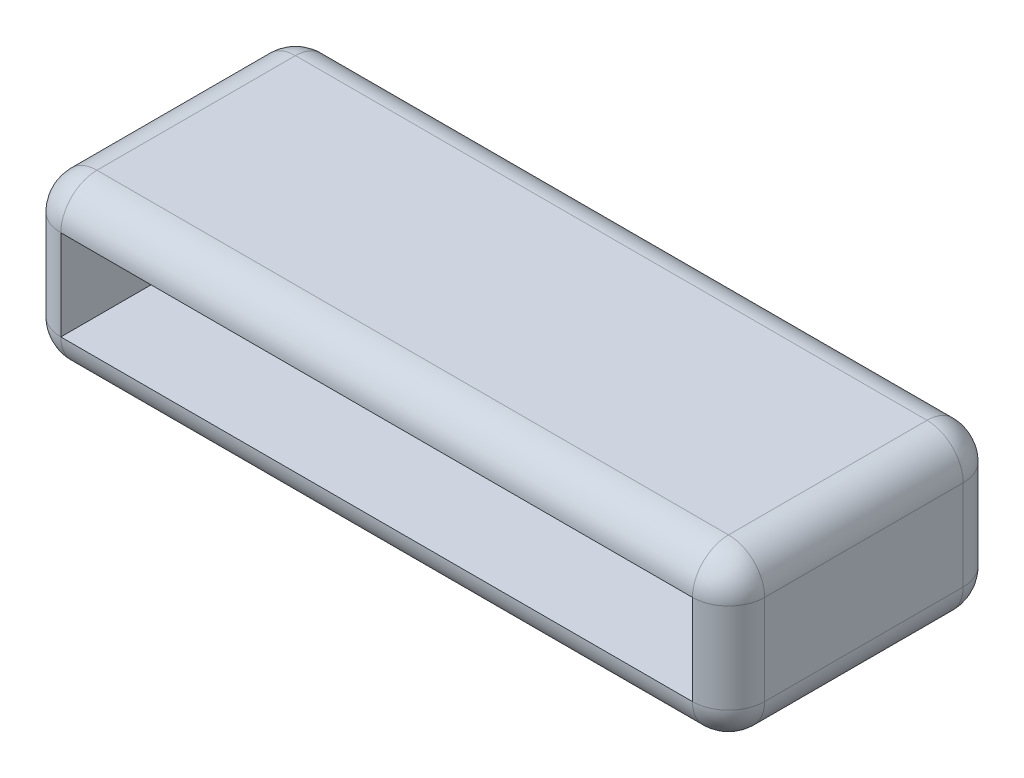
ISO-10303-21;
HEADER;
FILE_DESCRIPTION(('STEP AP214'),'2;1');
FILE_NAME('part.step','',(''),(''),'','','');
FILE_SCHEMA(('AUTOMOTIVE_DESIGN { 1 0 10303 214 1 1 1 1 }'));
ENDSEC;
DATA;
#1=APPLICATION_CONTEXT('core data for automotive mechanical design processes');
#2=APPLICATION_PROTOCOL_DEFINITION('international standard','automotive_design',2000,#1);
#3=PRODUCT_CONTEXT('',#1,'mechanical');
#4=PRODUCT('Part','Part','',(#3));
#5=PRODUCT_RELATED_PRODUCT_CATEGORY('part','',(#4));
#6=PRODUCT_DEFINITION_FORMATION('','',#4);
#7=PRODUCT_DEFINITION_CONTEXT('part definition',#1,'design');
#8=PRODUCT_DEFINITION('design','',#6,#7);
#9=PRODUCT_DEFINITION_SHAPE('','',#8);
#10=(LENGTH_UNIT() NAMED_UNIT(*) SI_UNIT(.MILLI.,.METRE.));
#11=(NAMED_UNIT(*) PLANE_ANGLE_UNIT() SI_UNIT($,.RADIAN.));
#12=(NAMED_UNIT(*) SI_UNIT($,.STERADIAN.) SOLID_ANGLE_UNIT());
#13=UNCERTAINTY_MEASURE_WITH_UNIT(LENGTH_MEASURE(1.E-05),#10,'distance_accuracy_value','');
#14=(GEOMETRIC_REPRESENTATION_CONTEXT(3) GLOBAL_UNCERTAINTY_ASSIGNED_CONTEXT((#13)) GLOBAL_UNIT_ASSIGNED_CONTEXT((#10,
#11,#12)) REPRESENTATION_CONTEXT('',''));
#15=CARTESIAN_POINT('',(0.,0.,0.));
#16=DIRECTION('',(0.,0.,1.));
#17=DIRECTION('',(1.,0.,0.));
#18=AXIS2_PLACEMENT_3D('',#15,#16,#17);
#19=CARTESIAN_POINT('',(19.5,-4.5,15.));
#20=DIRECTION('',(-1.,0.,0.));
#21=DIRECTION('',(0.,0.,1.));
#22=AXIS2_PLACEMENT_3D('',#19,#20,#21);
#23=PLANE('',#22);
#24=DIRECTION('',(0.,1.,0.));
#25=VECTOR('',#24,1.);
#26=CARTESIAN_POINT('',(19.5,-4.5,13.));
#27=LINE('',#26,#25);
#28=CARTESIAN_POINT('',(19.5,2.5,13.));
#29=VERTEX_POINT('',#28);
#30=CARTESIAN_POINT('',(19.5,-2.5,13.));
#31=VERTEX_POINT('',#30);
#32=EDGE_CURVE('E216',#29,#31,#27,.F.);
#33=ORIENTED_EDGE('',*,*,#32,.T.);
#34=DIRECTION('',(0.,0.,-1.));
#35=VECTOR('',#34,1.);
#36=CARTESIAN_POINT('',(19.5,-2.5,15.));
#37=LINE('',#36,#35);
#38=CARTESIAN_POINT('',(19.5,-2.5,2.));
#39=VERTEX_POINT('',#38);
#40=EDGE_CURVE('E218',#31,#39,#37,.T.);
#41=ORIENTED_EDGE('',*,*,#40,.T.);
#42=DIRECTION('',(0.,1.,0.));
#43=VECTOR('',#42,1.);
#44=CARTESIAN_POINT('',(19.5,4.5,2.));
#45=LINE('',#44,#43);
#46=CARTESIAN_POINT('',(19.5,2.5,2.));
#47=VERTEX_POINT('',#46);
#48=EDGE_CURVE('E214',#39,#47,#45,.T.);
#49=ORIENTED_EDGE('',*,*,#48,.T.);
#50=DIRECTION('',(0.,0.,-1.));
#51=VECTOR('',#50,1.);
#52=CARTESIAN_POINT('',(19.5,2.5,15.));
#53=LINE('',#52,#51);
#54=EDGE_CURVE('E212',#47,#29,#53,.F.);
#55=ORIENTED_EDGE('',*,*,#54,.T.);
#56=EDGE_LOOP('',(#33,#41,#49,#55));
#57=FACE_BOUND('',#56,.T.);
#58=ADVANCED_FACE('F47',(#57),#23,.F.);
#59=CARTESIAN_POINT('',(-19.5,4.5,15.));
#60=DIRECTION('',(0.,-1.,0.));
#61=DIRECTION('',(0.,0.,-1.));
#62=AXIS2_PLACEMENT_3D('',#59,#60,#61);
#63=PLANE('',#62);
#64=DIRECTION('',(-1.,0.,0.));
#65=VECTOR('',#64,1.);
#66=CARTESIAN_POINT('',(-19.5,4.5,13.));
#67=LINE('',#66,#65);
#68=CARTESIAN_POINT('',(-17.5,4.5,13.));
#69=VERTEX_POINT('',#68);
#70=CARTESIAN_POINT('',(17.5,4.5,13.));
#71=VERTEX_POINT('',#70);
#72=EDGE_CURVE('E56',#69,#71,#67,.F.);
#73=ORIENTED_EDGE('',*,*,#72,.T.);
#74=DIRECTION('',(0.,0.,-1.));
#75=VECTOR('',#74,1.);
#76=CARTESIAN_POINT('',(17.5,4.5,15.));
#77=LINE('',#76,#75);
#78=CARTESIAN_POINT('',(17.5,4.5,2.));
#79=VERTEX_POINT('',#78);
#80=EDGE_CURVE('E13',#71,#79,#77,.T.);
#81=ORIENTED_EDGE('',*,*,#80,.T.);
#82=DIRECTION('',(-1.,0.,0.));
#83=VECTOR('',#82,1.);
#84=CARTESIAN_POINT('',(-19.5,4.5,2.));
#85=LINE('',#84,#83);
#86=CARTESIAN_POINT('',(-17.5,4.5,2.));
#87=VERTEX_POINT('',#86);
#88=EDGE_CURVE('E221',#79,#87,#85,.T.);
#89=ORIENTED_EDGE('',*,*,#88,.T.);
#90=DIRECTION('',(0.,0.,-1.));
#91=VECTOR('',#90,1.);
#92=CARTESIAN_POINT('',(-17.5,4.5,15.));
#93=LINE('',#92,#91);
#94=EDGE_CURVE('E67',#87,#69,#93,.F.);
#95=ORIENTED_EDGE('',*,*,#94,.T.);
#96=EDGE_LOOP('',(#73,#81,#89,#95));
#97=FACE_BOUND('',#96,.T.);
#98=ADVANCED_FACE('F348',(#97),#63,.F.);
#99=CARTESIAN_POINT('',(-19.5,-4.5,15.));
#100=DIRECTION('',(1.,0.,0.));
#101=DIRECTION('',(0.,0.,-1.));
#102=AXIS2_PLACEMENT_3D('',#99,#100,#101);
#103=PLANE('',#102);
#104=DIRECTION('',(0.,-1.,0.));
#105=VECTOR('',#104,1.);
#106=CARTESIAN_POINT('',(-19.5,-4.5,2.));
#107=LINE('',#106,#105);
#108=CARTESIAN_POINT('',(-19.5,2.5,2.));
#109=VERTEX_POINT('',#108);
#110=CARTESIAN_POINT('',(-19.5,-2.5,2.));
#111=VERTEX_POINT('',#110);
#112=EDGE_CURVE('E187',#109,#111,#107,.T.);
#113=ORIENTED_EDGE('',*,*,#112,.T.);
#114=DIRECTION('',(0.,0.,-1.));
#115=VECTOR('',#114,1.);
#116=CARTESIAN_POINT('',(-19.5,-2.5,15.));
#117=LINE('',#116,#115);
#118=CARTESIAN_POINT('',(-19.5,-2.5,13.));
#119=VERTEX_POINT('',#118);
#120=EDGE_CURVE('E192',#111,#119,#117,.F.);
#121=ORIENTED_EDGE('',*,*,#120,.T.);
#122=DIRECTION('',(0.,-1.,0.));
#123=VECTOR('',#122,1.);
#124=CARTESIAN_POINT('',(-19.5,-4.5,13.));
#125=LINE('',#124,#123);
#126=CARTESIAN_POINT('',(-19.5,2.5,13.));
#127=VERTEX_POINT('',#126);
#128=EDGE_CURVE('E189',#119,#127,#125,.F.);
#129=ORIENTED_EDGE('',*,*,#128,.T.);
#130=DIRECTION('',(0.,0.,-1.));
#131=VECTOR('',#130,1.);
#132=CARTESIAN_POINT('',(-19.5,2.5,15.));
#133=LINE('',#132,#131);
#134=EDGE_CURVE('E185',#127,#109,#133,.T.);
#135=ORIENTED_EDGE('',*,*,#134,.T.);
#136=EDGE_LOOP('',(#113,#121,#129,#135));
#137=FACE_BOUND('',#136,.T.);
#138=ADVANCED_FACE('F361',(#137),#103,.F.);
#139=CARTESIAN_POINT('',(-19.5,-4.5,15.));
#140=DIRECTION('',(0.,1.,0.));
#141=DIRECTION('',(0.,0.,1.));
#142=AXIS2_PLACEMENT_3D('',#139,#140,#141);
#143=PLANE('',#142);
#144=DIRECTION('',(1.,0.,0.));
#145=VECTOR('',#144,1.);
#146=CARTESIAN_POINT('',(-19.5,-4.5,13.));
#147=LINE('',#146,#145);
#148=CARTESIAN_POINT('',(17.5,-4.5,13.));
#149=VERTEX_POINT('',#148);
#150=CARTESIAN_POINT('',(-17.5,-4.5,13.));
#151=VERTEX_POINT('',#150);
#152=EDGE_CURVE('E207',#149,#151,#147,.F.);
#153=ORIENTED_EDGE('',*,*,#152,.T.);
#154=DIRECTION('',(0.,0.,-1.));
#155=VECTOR('',#154,1.);
#156=CARTESIAN_POINT('',(-17.5000000000001,-4.5,15.));
#157=LINE('',#156,#155);
#158=CARTESIAN_POINT('',(-17.5,-4.5,2.));
#159=VERTEX_POINT('',#158);
#160=EDGE_CURVE('E209',#151,#159,#157,.T.);
#161=ORIENTED_EDGE('',*,*,#160,.T.);
#162=DIRECTION('',(1.,0.,0.));
#163=VECTOR('',#162,1.);
#164=CARTESIAN_POINT('',(19.5,-4.5,2.));
#165=LINE('',#164,#163);
#166=CARTESIAN_POINT('',(17.5,-4.5,2.));
#167=VERTEX_POINT('',#166);
#168=EDGE_CURVE('E205',#159,#167,#165,.T.);
#169=ORIENTED_EDGE('',*,*,#168,.T.);
#170=DIRECTION('',(0.,0.,-1.));
#171=VECTOR('',#170,1.);
#172=CARTESIAN_POINT('',(17.5,-4.5,15.));
#173=LINE('',#172,#171);
#174=EDGE_CURVE('E203',#167,#149,#173,.F.);
#175=ORIENTED_EDGE('',*,*,#174,.T.);
#176=EDGE_LOOP('',(#153,#161,#169,#175));
#177=FACE_BOUND('',#176,.T.);
#178=ADVANCED_FACE('F369',(#177),#143,.F.);
#179=CARTESIAN_POINT('',(0.,0.,0.));
#180=DIRECTION('',(0.,0.,-1.));
#181=DIRECTION('',(-1.,0.,0.));
#182=AXIS2_PLACEMENT_3D('',#179,#180,#181);
#183=PLANE('',#182);
#184=DIRECTION('',(1.,0.,0.));
#185=VECTOR('',#184,1.);
#186=CARTESIAN_POINT('',(-19.5,-2.5,0.));
#187=LINE('',#186,#185);
#188=CARTESIAN_POINT('',(17.5,-2.5,0.));
#189=VERTEX_POINT('',#188);
#190=CARTESIAN_POINT('',(-17.5,-2.5,0.));
#191=VERTEX_POINT('',#190);
#192=EDGE_CURVE('E198',#189,#191,#187,.F.);
#193=ORIENTED_EDGE('',*,*,#192,.T.);
#194=DIRECTION('',(0.,-1.,0.));
#195=VECTOR('',#194,1.);
#196=CARTESIAN_POINT('',(-17.5,4.5,0.));
#197=LINE('',#196,#195);
#198=CARTESIAN_POINT('',(-17.5,2.5,0.));
#199=VERTEX_POINT('',#198);
#200=EDGE_CURVE('E200',#191,#199,#197,.F.);
#201=ORIENTED_EDGE('',*,*,#200,.T.);
#202=DIRECTION('',(-1.,0.,0.));
#203=VECTOR('',#202,1.);
#204=CARTESIAN_POINT('',(19.5,2.5,0.));
#205=LINE('',#204,#203);
#206=CARTESIAN_POINT('',(17.5,2.5,0.));
#207=VERTEX_POINT('',#206);
#208=EDGE_CURVE('E194',#199,#207,#205,.F.);
#209=ORIENTED_EDGE('',*,*,#208,.T.);
#210=DIRECTION('',(0.,1.,0.));
#211=VECTOR('',#210,1.);
#212=CARTESIAN_POINT('',(17.5,-4.5,0.));
#213=LINE('',#212,#211);
#214=EDGE_CURVE('E196',#207,#189,#213,.F.);
#215=ORIENTED_EDGE('',*,*,#214,.T.);
#216=EDGE_LOOP('',(#193,#201,#209,#215));
#217=FACE_BOUND('',#216,.T.);
#218=ADVANCED_FACE('F579',(#217),#183,.T.);
#219=CARTESIAN_POINT('',(17.5,-4.5,15.));
#220=DIRECTION('',(-1.,0.,0.));
#221=DIRECTION('',(0.,0.,1.));
#222=AXIS2_PLACEMENT_3D('',#219,#220,#221);
#223=PLANE('',#222);
#224=DIRECTION('',(0.,1.,0.));
#225=VECTOR('',#224,1.);
#226=CARTESIAN_POINT('',(17.5,0.,2.));
#227=LINE('',#226,#225);
#228=CARTESIAN_POINT('',(17.5,-2.5,2.));
#229=VERTEX_POINT('',#228);
#230=CARTESIAN_POINT('',(17.5,2.5,2.));
#231=VERTEX_POINT('',#230);
#232=EDGE_CURVE('E153',#229,#231,#227,.T.);
#233=ORIENTED_EDGE('',*,*,#232,.F.);
#234=DIRECTION('',(0.,0.,-1.));
#235=VECTOR('',#234,1.);
#236=CARTESIAN_POINT('',(17.5,-2.5,15.));
#237=LINE('',#236,#235);
#238=CARTESIAN_POINT('',(17.5,-2.5,15.));
#239=VERTEX_POINT('',#238);
#240=EDGE_CURVE('E177',#239,#229,#237,.T.);
#241=ORIENTED_EDGE('',*,*,#240,.F.);
#242=DIRECTION('',(0.,1.,0.));
#243=VECTOR('',#242,1.);
#244=CARTESIAN_POINT('',(17.5,0.,15.));
#245=LINE('',#244,#243);
#246=CARTESIAN_POINT('',(17.5,2.5,15.));
#247=VERTEX_POINT('',#246);
#248=EDGE_CURVE('E174',#239,#247,#245,.T.);
#249=ORIENTED_EDGE('',*,*,#248,.T.);
#250=DIRECTION('',(0.,0.,-1.));
#251=VECTOR('',#250,1.);
#252=CARTESIAN_POINT('',(17.5,2.5,15.));
#253=LINE('',#252,#251);
#254=EDGE_CURVE('E166',#247,#231,#253,.T.);
#255=ORIENTED_EDGE('',*,*,#254,.T.);
#256=EDGE_LOOP('',(#233,#241,#249,#255));
#257=FACE_BOUND('',#256,.T.);
#258=ADVANCED_FACE('F307',(#257),#223,.T.);
#259=CARTESIAN_POINT('',(-19.5,2.5,15.));
#260=DIRECTION('',(0.,-1.,0.));
#261=DIRECTION('',(0.,0.,-1.));
#262=AXIS2_PLACEMENT_3D('',#259,#260,#261);
#263=PLANE('',#262);
#264=DIRECTION('',(-1.,0.,0.));
#265=VECTOR('',#264,1.);
#266=CARTESIAN_POINT('',(0.,2.5,2.));
#267=LINE('',#266,#265);
#268=CARTESIAN_POINT('',(-17.5,2.5,2.));
#269=VERTEX_POINT('',#268);
#270=EDGE_CURVE('E146',#231,#269,#267,.T.);
#271=ORIENTED_EDGE('',*,*,#270,.F.);
#272=ORIENTED_EDGE('',*,*,#254,.F.);
#273=DIRECTION('',(-1.,0.,0.));
#274=VECTOR('',#273,1.);
#275=CARTESIAN_POINT('',(0.,2.5,15.));
#276=LINE('',#275,#274);
#277=CARTESIAN_POINT('',(-17.5,2.5,15.));
#278=VERTEX_POINT('',#277);
#279=EDGE_CURVE('E162',#247,#278,#276,.T.);
#280=ORIENTED_EDGE('',*,*,#279,.T.);
#281=DIRECTION('',(0.,0.,-1.));
#282=VECTOR('',#281,1.);
#283=CARTESIAN_POINT('',(-17.5,2.5,15.));
#284=LINE('',#283,#282);
#285=EDGE_CURVE('E159',#278,#269,#284,.T.);
#286=ORIENTED_EDGE('',*,*,#285,.T.);
#287=EDGE_LOOP('',(#271,#272,#280,#286));
#288=FACE_BOUND('',#287,.T.);
#289=ADVANCED_FACE('F160',(#288),#263,.T.);
#290=CARTESIAN_POINT('',(-17.5000000000001,-4.5,15.));
#291=DIRECTION('',(1.,0.,0.));
#292=DIRECTION('',(0.,0.,-1.));
#293=AXIS2_PLACEMENT_3D('',#290,#291,#292);
#294=PLANE('',#293);
#295=DIRECTION('',(0.,-1.,0.));
#296=VECTOR('',#295,1.);
#297=CARTESIAN_POINT('',(-17.5,0.,2.));
#298=LINE('',#297,#296);
#299=CARTESIAN_POINT('',(-17.5,-2.5,2.));
#300=VERTEX_POINT('',#299);
#301=EDGE_CURVE('E150',#269,#300,#298,.T.);
#302=ORIENTED_EDGE('',*,*,#301,.F.);
#303=ORIENTED_EDGE('',*,*,#285,.F.);
#304=DIRECTION('',(0.,-1.,0.));
#305=VECTOR('',#304,1.);
#306=CARTESIAN_POINT('',(-17.5,0.,15.));
#307=LINE('',#306,#305);
#308=CARTESIAN_POINT('',(-17.5,-2.5,15.));
#309=VERTEX_POINT('',#308);
#310=EDGE_CURVE('E181',#278,#309,#307,.T.);
#311=ORIENTED_EDGE('',*,*,#310,.T.);
#312=DIRECTION('',(0.,0.,-1.));
#313=VECTOR('',#312,1.);
#314=CARTESIAN_POINT('',(-17.5,-2.5,15.));
#315=LINE('',#314,#313);
#316=EDGE_CURVE('E167',#309,#300,#315,.T.);
#317=ORIENTED_EDGE('',*,*,#316,.T.);
#318=EDGE_LOOP('',(#302,#303,#311,#317));
#319=FACE_BOUND('',#318,.T.);
#320=ADVANCED_FACE('F169',(#319),#294,.T.);
#321=CARTESIAN_POINT('',(-19.5,-2.5,15.));
#322=DIRECTION('',(0.,1.,0.));
#323=DIRECTION('',(0.,0.,1.));
#324=AXIS2_PLACEMENT_3D('',#321,#322,#323);
#325=PLANE('',#324);
#326=DIRECTION('',(1.,0.,0.));
#327=VECTOR('',#326,1.);
#328=CARTESIAN_POINT('',(0.,-2.5,2.));
#329=LINE('',#328,#327);
#330=EDGE_CURVE('E172',#300,#229,#329,.T.);
#331=ORIENTED_EDGE('',*,*,#330,.F.);
#332=ORIENTED_EDGE('',*,*,#316,.F.);
#333=DIRECTION('',(1.,0.,0.));
#334=VECTOR('',#333,1.);
#335=CARTESIAN_POINT('',(0.,-2.5,15.));
#336=LINE('',#335,#334);
#337=EDGE_CURVE('E183',#309,#239,#336,.T.);
#338=ORIENTED_EDGE('',*,*,#337,.T.);
#339=ORIENTED_EDGE('',*,*,#240,.T.);
#340=EDGE_LOOP('',(#331,#332,#338,#339));
#341=FACE_BOUND('',#340,.T.);
#342=ADVANCED_FACE('F303',(#341),#325,.T.);
#343=CARTESIAN_POINT('',(0.,0.,2.));
#344=DIRECTION('',(0.,0.,-1.));
#345=DIRECTION('',(-1.,0.,0.));
#346=AXIS2_PLACEMENT_3D('',#343,#344,#345);
#347=PLANE('',#346);
#348=ORIENTED_EDGE('',*,*,#232,.T.);
#349=ORIENTED_EDGE('',*,*,#270,.T.);
#350=ORIENTED_EDGE('',*,*,#301,.T.);
#351=ORIENTED_EDGE('',*,*,#330,.T.);
#352=EDGE_LOOP('',(#348,#349,#350,#351));
#353=FACE_BOUND('',#352,.T.);
#354=ADVANCED_FACE('F148',(#353),#347,.F.);
#355=CARTESIAN_POINT('',(17.5,-4.5,2.));
#356=DIRECTION('',(0.,-1.,0.));
#357=DIRECTION('',(0.,0.,-1.));
#358=AXIS2_PLACEMENT_3D('',#355,#356,#357);
#359=CYLINDRICAL_SURFACE('',#358,2.);
#360=CARTESIAN_POINT('',(17.5,2.5,2.));
#361=DIRECTION('',(0.,1.,0.));
#362=DIRECTION('',(0.,0.,1.));
#363=AXIS2_PLACEMENT_3D('',#360,#361,#362);
#364=CIRCLE('',#363,2.);
#365=EDGE_CURVE('E51',#47,#207,#364,.T.);
#366=ORIENTED_EDGE('',*,*,#365,.F.);
#367=ORIENTED_EDGE('',*,*,#48,.F.);
#368=CARTESIAN_POINT('',(17.5,-2.5,2.));
#369=DIRECTION('',(0.,-1.,0.));
#370=DIRECTION('',(0.,0.,-1.));
#371=AXIS2_PLACEMENT_3D('',#368,#369,#370);
#372=CIRCLE('',#371,2.);
#373=EDGE_CURVE('E285',#189,#39,#372,.T.);
#374=ORIENTED_EDGE('',*,*,#373,.F.);
#375=ORIENTED_EDGE('',*,*,#214,.F.);
#376=EDGE_LOOP('',(#366,#367,#374,#375));
#377=FACE_BOUND('',#376,.T.);
#378=ADVANCED_FACE('F49',(#377),#359,.T.);
#379=CARTESIAN_POINT('',(17.5,2.5,2.));
#380=DIRECTION('',(0.,0.,1.));
#381=DIRECTION('',(1.,0.,0.));
#382=AXIS2_PLACEMENT_3D('',#379,#380,#381);
#383=SPHERICAL_SURFACE('',#382,2.);
#384=CARTESIAN_POINT('',(17.5,2.5,2.));
#385=DIRECTION('',(0.,0.,-1.));
#386=DIRECTION('',(-1.,0.,0.));
#387=AXIS2_PLACEMENT_3D('',#384,#385,#386);
#388=CIRCLE('',#387,2.);
#389=EDGE_CURVE('E280',#47,#79,#388,.F.);
#390=ORIENTED_EDGE('',*,*,#389,.F.);
#391=ORIENTED_EDGE('',*,*,#365,.T.);
#392=CARTESIAN_POINT('',(17.5,2.5,2.));
#393=DIRECTION('',(1.,0.,0.));
#394=DIRECTION('',(0.,0.,-1.));
#395=AXIS2_PLACEMENT_3D('',#392,#393,#394);
#396=CIRCLE('',#395,2.);
#397=EDGE_CURVE('E283',#79,#207,#396,.F.);
#398=ORIENTED_EDGE('',*,*,#397,.F.);
#399=EDGE_LOOP('',(#390,#391,#398));
#400=FACE_BOUND('',#399,.T.);
#401=ADVANCED_FACE('F377',(#400),#383,.T.);
#402=CARTESIAN_POINT('',(17.5,-2.5,2.));
#403=DIRECTION('',(0.,0.,1.));
#404=DIRECTION('',(1.,0.,0.));
#405=AXIS2_PLACEMENT_3D('',#402,#403,#404);
#406=SPHERICAL_SURFACE('',#405,2.);
#407=CARTESIAN_POINT('',(17.5,-2.5,2.));
#408=DIRECTION('',(1.,0.,0.));
#409=DIRECTION('',(0.,0.,-1.));
#410=AXIS2_PLACEMENT_3D('',#407,#408,#409);
#411=CIRCLE('',#410,2.);
#412=EDGE_CURVE('E275',#189,#167,#411,.F.);
#413=ORIENTED_EDGE('',*,*,#412,.F.);
#414=ORIENTED_EDGE('',*,*,#373,.T.);
#415=CARTESIAN_POINT('',(17.5,-2.5,2.));
#416=DIRECTION('',(0.,0.,-1.));
#417=DIRECTION('',(-1.,0.,0.));
#418=AXIS2_PLACEMENT_3D('',#415,#416,#417);
#419=CIRCLE('',#418,2.);
#420=EDGE_CURVE('E278',#167,#39,#419,.F.);
#421=ORIENTED_EDGE('',*,*,#420,.F.);
#422=EDGE_LOOP('',(#413,#414,#421));
#423=FACE_BOUND('',#422,.T.);
#424=ADVANCED_FACE('F375',(#423),#406,.T.);
#425=CARTESIAN_POINT('',(-19.5,2.5,2.));
#426=DIRECTION('',(1.,0.,0.));
#427=DIRECTION('',(0.,0.,-1.));
#428=AXIS2_PLACEMENT_3D('',#425,#426,#427);
#429=CYLINDRICAL_SURFACE('',#428,2.);
#430=ORIENTED_EDGE('',*,*,#397,.T.);
#431=ORIENTED_EDGE('',*,*,#208,.F.);
#432=CARTESIAN_POINT('',(-17.5,2.5,2.));
#433=DIRECTION('',(-1.,0.,0.));
#434=DIRECTION('',(0.,0.,1.));
#435=AXIS2_PLACEMENT_3D('',#432,#433,#434);
#436=CIRCLE('',#435,2.);
#437=EDGE_CURVE('E270',#87,#199,#436,.T.);
#438=ORIENTED_EDGE('',*,*,#437,.F.);
#439=ORIENTED_EDGE('',*,*,#88,.F.);
#440=EDGE_LOOP('',(#430,#431,#438,#439));
#441=FACE_BOUND('',#440,.T.);
#442=ADVANCED_FACE('F353',(#441),#429,.T.);
#443=CARTESIAN_POINT('',(17.5,2.5,15.));
#444=DIRECTION('',(0.,0.,-1.));
#445=DIRECTION('',(-1.,0.,0.));
#446=AXIS2_PLACEMENT_3D('',#443,#444,#445);
#447=CYLINDRICAL_SURFACE('',#446,2.);
#448=ORIENTED_EDGE('',*,*,#389,.T.);
#449=ORIENTED_EDGE('',*,*,#80,.F.);
#450=CARTESIAN_POINT('',(17.5,2.5,13.));
#451=DIRECTION('',(0.,0.,1.));
#452=DIRECTION('',(1.,0.,0.));
#453=AXIS2_PLACEMENT_3D('',#450,#451,#452);
#454=CIRCLE('',#453,2.);
#455=EDGE_CURVE('E267',#29,#71,#454,.T.);
#456=ORIENTED_EDGE('',*,*,#455,.F.);
#457=ORIENTED_EDGE('',*,*,#54,.F.);
#458=EDGE_LOOP('',(#448,#449,#456,#457));
#459=FACE_BOUND('',#458,.T.);
#460=ADVANCED_FACE('F347',(#459),#447,.T.);
#461=CARTESIAN_POINT('',(17.5,0.,13.));
#462=DIRECTION('',(0.,1.,0.));
#463=DIRECTION('',(0.,0.,1.));
#464=AXIS2_PLACEMENT_3D('',#461,#462,#463);
#465=CYLINDRICAL_SURFACE('',#464,2.);
#466=CARTESIAN_POINT('',(17.5,-2.5,13.));
#467=DIRECTION('',(0.,-1.,0.));
#468=DIRECTION('',(0.,0.,-1.));
#469=AXIS2_PLACEMENT_3D('',#466,#467,#468);
#470=CIRCLE('',#469,2.);
#471=EDGE_CURVE('E261',#31,#239,#470,.T.);
#472=ORIENTED_EDGE('',*,*,#471,.F.);
#473=ORIENTED_EDGE('',*,*,#32,.F.);
#474=CARTESIAN_POINT('',(17.5,2.5,13.));
#475=DIRECTION('',(0.,1.,0.));
#476=DIRECTION('',(0.,0.,1.));
#477=AXIS2_PLACEMENT_3D('',#474,#475,#476);
#478=CIRCLE('',#477,2.);
#479=EDGE_CURVE('E264',#247,#29,#478,.T.);
#480=ORIENTED_EDGE('',*,*,#479,.F.);
#481=ORIENTED_EDGE('',*,*,#248,.F.);
#482=EDGE_LOOP('',(#472,#473,#480,#481));
#483=FACE_BOUND('',#482,.T.);
#484=ADVANCED_FACE('F313',(#483),#465,.T.);
#485=CARTESIAN_POINT('',(17.5,-2.5,15.));
#486=DIRECTION('',(0.,0.,-1.));
#487=DIRECTION('',(-1.,0.,0.));
#488=AXIS2_PLACEMENT_3D('',#485,#486,#487);
#489=CYLINDRICAL_SURFACE('',#488,2.);
#490=ORIENTED_EDGE('',*,*,#420,.T.);
#491=ORIENTED_EDGE('',*,*,#40,.F.);
#492=CARTESIAN_POINT('',(17.5,-2.5,13.));
#493=DIRECTION('',(0.,0.,1.));
#494=DIRECTION('',(1.,0.,0.));
#495=AXIS2_PLACEMENT_3D('',#492,#493,#494);
#496=CIRCLE('',#495,2.);
#497=EDGE_CURVE('E258',#149,#31,#496,.T.);
#498=ORIENTED_EDGE('',*,*,#497,.F.);
#499=ORIENTED_EDGE('',*,*,#174,.F.);
#500=EDGE_LOOP('',(#490,#491,#498,#499));
#501=FACE_BOUND('',#500,.T.);
#502=ADVANCED_FACE('F343',(#501),#489,.T.);
#503=CARTESIAN_POINT('',(-19.5,-2.5,2.));
#504=DIRECTION('',(-1.,0.,0.));
#505=DIRECTION('',(0.,0.,1.));
#506=AXIS2_PLACEMENT_3D('',#503,#504,#505);
#507=CYLINDRICAL_SURFACE('',#506,2.);
#508=ORIENTED_EDGE('',*,*,#412,.T.);
#509=ORIENTED_EDGE('',*,*,#168,.F.);
#510=CARTESIAN_POINT('',(-17.5,-2.5,2.));
#511=DIRECTION('',(-1.,0.,0.));
#512=DIRECTION('',(0.,0.,1.));
#513=AXIS2_PLACEMENT_3D('',#510,#511,#512);
#514=CIRCLE('',#513,2.);
#515=EDGE_CURVE('E255',#191,#159,#514,.T.);
#516=ORIENTED_EDGE('',*,*,#515,.F.);
#517=ORIENTED_EDGE('',*,*,#192,.F.);
#518=EDGE_LOOP('',(#508,#509,#516,#517));
#519=FACE_BOUND('',#518,.T.);
#520=ADVANCED_FACE('F374',(#519),#507,.T.);
#521=CARTESIAN_POINT('',(-17.5,-4.5,2.));
#522=DIRECTION('',(0.,1.,0.));
#523=DIRECTION('',(0.,0.,1.));
#524=AXIS2_PLACEMENT_3D('',#521,#522,#523);
#525=CYLINDRICAL_SURFACE('',#524,2.);
#526=CARTESIAN_POINT('',(-17.5,2.5,2.));
#527=DIRECTION('',(0.,1.,0.));
#528=DIRECTION('',(0.,0.,1.));
#529=AXIS2_PLACEMENT_3D('',#526,#527,#528);
#530=CIRCLE('',#529,2.);
#531=EDGE_CURVE('E272',#199,#109,#530,.T.);
#532=ORIENTED_EDGE('',*,*,#531,.F.);
#533=ORIENTED_EDGE('',*,*,#200,.F.);
#534=CARTESIAN_POINT('',(-17.5,-2.5,2.));
#535=DIRECTION('',(0.,-1.,0.));
#536=DIRECTION('',(0.,0.,-1.));
#537=AXIS2_PLACEMENT_3D('',#534,#535,#536);
#538=CIRCLE('',#537,2.);
#539=EDGE_CURVE('E252',#111,#191,#538,.T.);
#540=ORIENTED_EDGE('',*,*,#539,.F.);
#541=ORIENTED_EDGE('',*,*,#112,.F.);
#542=EDGE_LOOP('',(#532,#533,#540,#541));
#543=FACE_BOUND('',#542,.T.);
#544=ADVANCED_FACE('F416',(#543),#525,.T.);
#545=CARTESIAN_POINT('',(-17.5,2.5,2.));
#546=DIRECTION('',(0.,0.,1.));
#547=DIRECTION('',(1.,0.,0.));
#548=AXIS2_PLACEMENT_3D('',#545,#546,#547);
#549=SPHERICAL_SURFACE('',#548,2.);
#550=ORIENTED_EDGE('',*,*,#437,.T.);
#551=ORIENTED_EDGE('',*,*,#531,.T.);
#552=CARTESIAN_POINT('',(-17.5,2.5,2.));
#553=DIRECTION('',(0.,0.,-1.));
#554=DIRECTION('',(-1.,0.,0.));
#555=AXIS2_PLACEMENT_3D('',#552,#553,#554);
#556=CIRCLE('',#555,2.);
#557=EDGE_CURVE('E249',#87,#109,#556,.F.);
#558=ORIENTED_EDGE('',*,*,#557,.F.);
#559=EDGE_LOOP('',(#550,#551,#558));
#560=FACE_BOUND('',#559,.T.);
#561=ADVANCED_FACE('F356',(#560),#549,.T.);
#562=CARTESIAN_POINT('',(17.5,2.5,13.));
#563=DIRECTION('',(0.,0.,1.));
#564=DIRECTION('',(1.,0.,0.));
#565=AXIS2_PLACEMENT_3D('',#562,#563,#564);
#566=SPHERICAL_SURFACE('',#565,2.);
#567=ORIENTED_EDGE('',*,*,#479,.T.);
#568=ORIENTED_EDGE('',*,*,#455,.T.);
#569=CARTESIAN_POINT('',(17.5,2.5,13.));
#570=DIRECTION('',(1.,0.,0.));
#571=DIRECTION('',(0.,0.,-1.));
#572=AXIS2_PLACEMENT_3D('',#569,#570,#571);
#573=CIRCLE('',#572,2.);
#574=EDGE_CURVE('E246',#247,#71,#573,.F.);
#575=ORIENTED_EDGE('',*,*,#574,.F.);
#576=EDGE_LOOP('',(#567,#568,#575));
#577=FACE_BOUND('',#576,.T.);
#578=ADVANCED_FACE('F316',(#577),#566,.T.);
#579=CARTESIAN_POINT('',(17.5,-2.5,13.));
#580=DIRECTION('',(0.,0.,1.));
#581=DIRECTION('',(1.,0.,0.));
#582=AXIS2_PLACEMENT_3D('',#579,#580,#581);
#583=SPHERICAL_SURFACE('',#582,2.);
#584=ORIENTED_EDGE('',*,*,#497,.T.);
#585=ORIENTED_EDGE('',*,*,#471,.T.);
#586=CARTESIAN_POINT('',(17.5,-2.5,13.));
#587=DIRECTION('',(1.,0.,0.));
#588=DIRECTION('',(0.,0.,-1.));
#589=AXIS2_PLACEMENT_3D('',#586,#587,#588);
#590=CIRCLE('',#589,2.);
#591=EDGE_CURVE('E243',#149,#239,#590,.F.);
#592=ORIENTED_EDGE('',*,*,#591,.F.);
#593=EDGE_LOOP('',(#584,#585,#592));
#594=FACE_BOUND('',#593,.T.);
#595=ADVANCED_FACE('F338',(#594),#583,.T.);
#596=CARTESIAN_POINT('',(-17.5,-2.5,2.));
#597=DIRECTION('',(0.,0.,1.));
#598=DIRECTION('',(1.,0.,0.));
#599=AXIS2_PLACEMENT_3D('',#596,#597,#598);
#600=SPHERICAL_SURFACE('',#599,2.);
#601=ORIENTED_EDGE('',*,*,#539,.T.);
#602=ORIENTED_EDGE('',*,*,#515,.T.);
#603=CARTESIAN_POINT('',(-17.5,-2.5,2.));
#604=DIRECTION('',(0.,0.,-1.));
#605=DIRECTION('',(-1.,0.,0.));
#606=AXIS2_PLACEMENT_3D('',#603,#604,#605);
#607=CIRCLE('',#606,2.);
#608=EDGE_CURVE('E241',#111,#159,#607,.F.);
#609=ORIENTED_EDGE('',*,*,#608,.F.);
#610=EDGE_LOOP('',(#601,#602,#609));
#611=FACE_BOUND('',#610,.T.);
#612=ADVANCED_FACE('F406',(#611),#600,.T.);
#613=CARTESIAN_POINT('',(-17.5,2.5,15.));
#614=DIRECTION('',(0.,0.,-1.));
#615=DIRECTION('',(-1.,0.,0.));
#616=AXIS2_PLACEMENT_3D('',#613,#614,#615);
#617=CYLINDRICAL_SURFACE('',#616,2.);
#618=ORIENTED_EDGE('',*,*,#557,.T.);
#619=ORIENTED_EDGE('',*,*,#134,.F.);
#620=CARTESIAN_POINT('',(-17.5,2.5,13.));
#621=DIRECTION('',(0.,0.,1.));
#622=DIRECTION('',(1.,0.,0.));
#623=AXIS2_PLACEMENT_3D('',#620,#621,#622);
#624=CIRCLE('',#623,2.);
#625=EDGE_CURVE('E238',#69,#127,#624,.T.);
#626=ORIENTED_EDGE('',*,*,#625,.F.);
#627=ORIENTED_EDGE('',*,*,#94,.F.);
#628=EDGE_LOOP('',(#618,#619,#626,#627));
#629=FACE_BOUND('',#628,.T.);
#630=ADVANCED_FACE('F358',(#629),#617,.T.);
#631=CARTESIAN_POINT('',(0.,2.5,13.));
#632=DIRECTION('',(-1.,0.,0.));
#633=DIRECTION('',(0.,0.,1.));
#634=AXIS2_PLACEMENT_3D('',#631,#632,#633);
#635=CYLINDRICAL_SURFACE('',#634,2.);
#636=ORIENTED_EDGE('',*,*,#574,.T.);
#637=ORIENTED_EDGE('',*,*,#72,.F.);
#638=CARTESIAN_POINT('',(-17.5,2.5,13.));
#639=DIRECTION('',(-1.,0.,0.));
#640=DIRECTION('',(0.,0.,1.));
#641=AXIS2_PLACEMENT_3D('',#638,#639,#640);
#642=CIRCLE('',#641,2.);
#643=EDGE_CURVE('E235',#278,#69,#642,.T.);
#644=ORIENTED_EDGE('',*,*,#643,.F.);
#645=ORIENTED_EDGE('',*,*,#279,.F.);
#646=EDGE_LOOP('',(#636,#637,#644,#645));
#647=FACE_BOUND('',#646,.T.);
#648=ADVANCED_FACE('F318',(#647),#635,.T.);
#649=CARTESIAN_POINT('',(0.,-2.5,13.));
#650=DIRECTION('',(1.,0.,0.));
#651=DIRECTION('',(0.,0.,-1.));
#652=AXIS2_PLACEMENT_3D('',#649,#650,#651);
#653=CYLINDRICAL_SURFACE('',#652,2.);
#654=ORIENTED_EDGE('',*,*,#591,.T.);
#655=ORIENTED_EDGE('',*,*,#337,.F.);
#656=CARTESIAN_POINT('',(-17.5,-2.5,13.));
#657=DIRECTION('',(-1.,0.,0.));
#658=DIRECTION('',(0.,0.,1.));
#659=AXIS2_PLACEMENT_3D('',#656,#657,#658);
#660=CIRCLE('',#659,2.);
#661=EDGE_CURVE('E232',#151,#309,#660,.T.);
#662=ORIENTED_EDGE('',*,*,#661,.F.);
#663=ORIENTED_EDGE('',*,*,#152,.F.);
#664=EDGE_LOOP('',(#654,#655,#662,#663));
#665=FACE_BOUND('',#664,.T.);
#666=ADVANCED_FACE('F335',(#665),#653,.T.);
#667=CARTESIAN_POINT('',(-17.5,-2.5,15.));
#668=DIRECTION('',(0.,0.,-1.));
#669=DIRECTION('',(-1.,0.,0.));
#670=AXIS2_PLACEMENT_3D('',#667,#668,#669);
#671=CYLINDRICAL_SURFACE('',#670,2.);
#672=ORIENTED_EDGE('',*,*,#608,.T.);
#673=ORIENTED_EDGE('',*,*,#160,.F.);
#674=CARTESIAN_POINT('',(-17.5,-2.5,13.));
#675=DIRECTION('',(0.,0.,1.));
#676=DIRECTION('',(1.,0.,0.));
#677=AXIS2_PLACEMENT_3D('',#674,#675,#676);
#678=CIRCLE('',#677,2.);
#679=EDGE_CURVE('E229',#119,#151,#678,.T.);
#680=ORIENTED_EDGE('',*,*,#679,.F.);
#681=ORIENTED_EDGE('',*,*,#120,.F.);
#682=EDGE_LOOP('',(#672,#673,#680,#681));
#683=FACE_BOUND('',#682,.T.);
#684=ADVANCED_FACE('F366',(#683),#671,.T.);
#685=CARTESIAN_POINT('',(-17.5,2.5,13.));
#686=DIRECTION('',(0.,0.,1.));
#687=DIRECTION('',(1.,0.,0.));
#688=AXIS2_PLACEMENT_3D('',#685,#686,#687);
#689=SPHERICAL_SURFACE('',#688,2.);
#690=ORIENTED_EDGE('',*,*,#643,.T.);
#691=ORIENTED_EDGE('',*,*,#625,.T.);
#692=CARTESIAN_POINT('',(-17.5,2.5,13.));
#693=DIRECTION('',(0.,1.,0.));
#694=DIRECTION('',(0.,0.,1.));
#695=AXIS2_PLACEMENT_3D('',#692,#693,#694);
#696=CIRCLE('',#695,2.);
#697=EDGE_CURVE('E227',#278,#127,#696,.F.);
#698=ORIENTED_EDGE('',*,*,#697,.F.);
#699=EDGE_LOOP('',(#690,#691,#698));
#700=FACE_BOUND('',#699,.T.);
#701=ADVANCED_FACE('F323',(#700),#689,.T.);
#702=CARTESIAN_POINT('',(-17.5,-2.5,13.));
#703=DIRECTION('',(0.,0.,1.));
#704=DIRECTION('',(1.,0.,0.));
#705=AXIS2_PLACEMENT_3D('',#702,#703,#704);
#706=SPHERICAL_SURFACE('',#705,2.);
#707=ORIENTED_EDGE('',*,*,#679,.T.);
#708=ORIENTED_EDGE('',*,*,#661,.T.);
#709=CARTESIAN_POINT('',(-17.5,-2.5,13.));
#710=DIRECTION('',(0.,-1.,0.));
#711=DIRECTION('',(0.,0.,-1.));
#712=AXIS2_PLACEMENT_3D('',#709,#710,#711);
#713=CIRCLE('',#712,2.);
#714=EDGE_CURVE('E225',#119,#309,#713,.F.);
#715=ORIENTED_EDGE('',*,*,#714,.F.);
#716=EDGE_LOOP('',(#707,#708,#715));
#717=FACE_BOUND('',#716,.T.);
#718=ADVANCED_FACE('F331',(#717),#706,.T.);
#719=CARTESIAN_POINT('',(-17.5,0.,13.));
#720=DIRECTION('',(0.,-1.,0.));
#721=DIRECTION('',(0.,0.,-1.));
#722=AXIS2_PLACEMENT_3D('',#719,#720,#721);
#723=CYLINDRICAL_SURFACE('',#722,2.);
#724=ORIENTED_EDGE('',*,*,#697,.T.);
#725=ORIENTED_EDGE('',*,*,#128,.F.);
#726=ORIENTED_EDGE('',*,*,#714,.T.);
#727=ORIENTED_EDGE('',*,*,#310,.F.);
#728=EDGE_LOOP('',(#724,#725,#726,#727));
#729=FACE_BOUND('',#728,.T.);
#730=ADVANCED_FACE('F327',(#729),#723,.T.);
#731=CLOSED_SHELL('',(#58,#98,#138,#178,#218,#258,#289,#320,#342,#354,#378,#401,#424,#442,#460,
#484,#502,#520,#544,#561,#578,#595,#612,#630,#648,#666,#684,#701,#718,#730));
#732=MANIFOLD_SOLID_BREP('B2',#731);
#733=ADVANCED_BREP_SHAPE_REPRESENTATION('',(#18,#732),#14);
#734=SHAPE_DEFINITION_REPRESENTATION(#9,#733);
ENDSEC;
END-ISO-10303-21;
